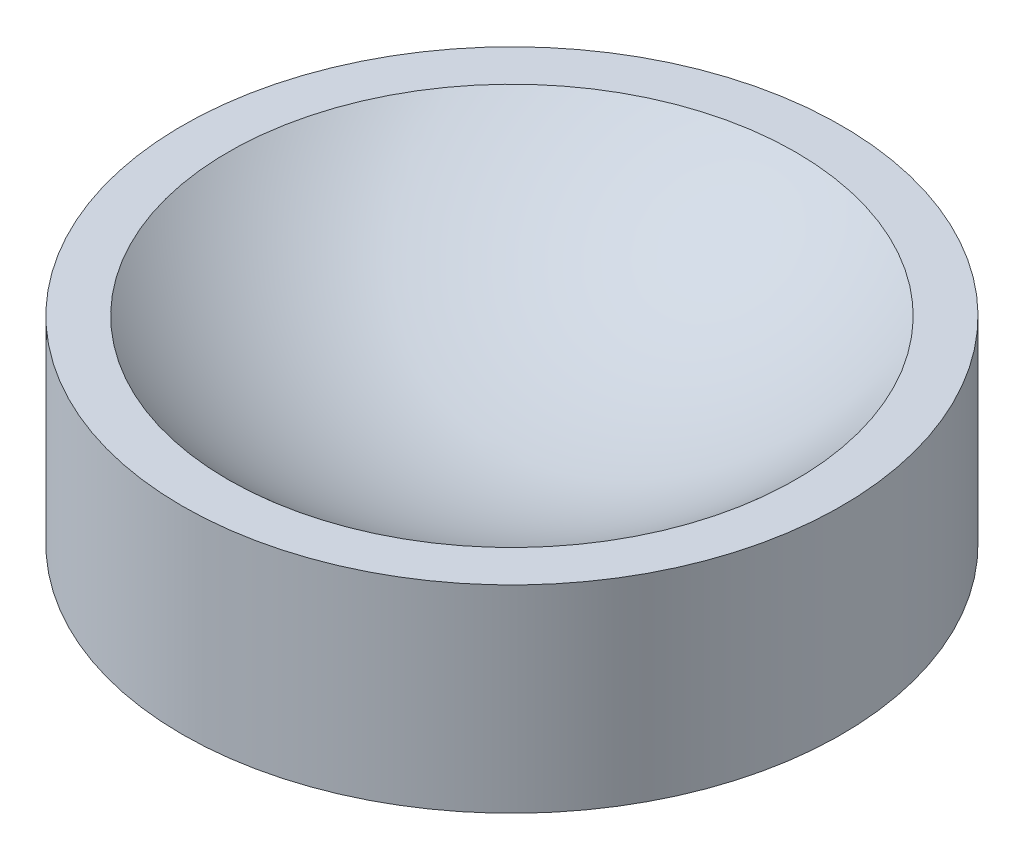
ISO-10303-21;
HEADER;
FILE_DESCRIPTION(('STEP AP214'),'2;1');
FILE_NAME('part.step','',(''),(''),'','','');
FILE_SCHEMA(('AUTOMOTIVE_DESIGN { 1 0 10303 214 1 1 1 1 }'));
ENDSEC;
DATA;
#1=APPLICATION_CONTEXT('core data for automotive mechanical design processes');
#2=APPLICATION_PROTOCOL_DEFINITION('international standard','automotive_design',2000,#1);
#3=PRODUCT_CONTEXT('',#1,'mechanical');
#4=PRODUCT('Part','Part','',(#3));
#5=PRODUCT_RELATED_PRODUCT_CATEGORY('part','',(#4));
#6=PRODUCT_DEFINITION_FORMATION('','',#4);
#7=PRODUCT_DEFINITION_CONTEXT('part definition',#1,'design');
#8=PRODUCT_DEFINITION('design','',#6,#7);
#9=PRODUCT_DEFINITION_SHAPE('','',#8);
#10=(LENGTH_UNIT() NAMED_UNIT(*) SI_UNIT(.MILLI.,.METRE.));
#11=(NAMED_UNIT(*) PLANE_ANGLE_UNIT() SI_UNIT($,.RADIAN.));
#12=(NAMED_UNIT(*) SI_UNIT($,.STERADIAN.) SOLID_ANGLE_UNIT());
#13=UNCERTAINTY_MEASURE_WITH_UNIT(LENGTH_MEASURE(1.E-05),#10,'distance_accuracy_value','');
#14=(GEOMETRIC_REPRESENTATION_CONTEXT(3) GLOBAL_UNCERTAINTY_ASSIGNED_CONTEXT((#13)) GLOBAL_UNIT_ASSIGNED_CONTEXT((#10,
#11,#12)) REPRESENTATION_CONTEXT('',''));
#15=CARTESIAN_POINT('',(0.,0.,0.));
#16=DIRECTION('',(0.,0.,1.));
#17=DIRECTION('',(1.,0.,0.));
#18=AXIS2_PLACEMENT_3D('',#15,#16,#17);
#19=CARTESIAN_POINT('',(0.,15.,0.));
#20=DIRECTION('',(0.,-1.,0.));
#21=DIRECTION('',(0.,0.,-1.));
#22=AXIS2_PLACEMENT_3D('',#19,#20,#21);
#23=CYLINDRICAL_SURFACE('',#22,25.);
#24=CARTESIAN_POINT('',(0.,15.,0.));
#25=DIRECTION('',(0.,1.,0.));
#26=DIRECTION('',(0.,0.,1.));
#27=AXIS2_PLACEMENT_3D('',#24,#25,#26);
#28=CIRCLE('',#27,25.);
#29=CARTESIAN_POINT('',(0.,15.,25.));
#30=VERTEX_POINT('',#29);
#31=EDGE_CURVE('E10',#30,#30,#28,.T.);
#32=ORIENTED_EDGE('',*,*,#31,.F.);
#33=EDGE_LOOP('',(#32));
#34=FACE_BOUND('',#33,.T.);
#35=CARTESIAN_POINT('',(0.,0.,0.));
#36=DIRECTION('',(0.,1.,0.));
#37=DIRECTION('',(0.,0.,1.));
#38=AXIS2_PLACEMENT_3D('',#35,#36,#37);
#39=CIRCLE('',#38,25.);
#40=CARTESIAN_POINT('',(0.,0.,25.));
#41=VERTEX_POINT('',#40);
#42=EDGE_CURVE('E51',#41,#41,#39,.T.);
#43=ORIENTED_EDGE('',*,*,#42,.T.);
#44=EDGE_LOOP('',(#43));
#45=FACE_BOUND('',#44,.T.);
#46=ADVANCED_FACE('F43',(#34,#45),#23,.T.);
#47=CARTESIAN_POINT('',(0.,15.,0.));
#48=DIRECTION('',(0.,1.,0.));
#49=DIRECTION('',(0.,0.,1.));
#50=AXIS2_PLACEMENT_3D('',#47,#48,#49);
#51=PLANE('',#50);
#52=CARTESIAN_POINT('',(0.,15.,0.));
#53=DIRECTION('',(0.,1.,0.));
#54=DIRECTION('',(0.,0.,1.));
#55=AXIS2_PLACEMENT_3D('',#52,#53,#54);
#56=CIRCLE('',#55,21.5232432500309);
#57=CARTESIAN_POINT('',(0.,15.,21.5232432500309));
#58=VERTEX_POINT('',#57);
#59=EDGE_CURVE('E46',#58,#58,#56,.F.);
#60=ORIENTED_EDGE('',*,*,#59,.T.);
#61=EDGE_LOOP('',(#60));
#62=FACE_BOUND('',#61,.T.);
#63=ORIENTED_EDGE('',*,*,#31,.T.);
#64=EDGE_LOOP('',(#63));
#65=FACE_BOUND('',#64,.T.);
#66=ADVANCED_FACE('F63',(#62,#65),#51,.T.);
#67=CARTESIAN_POINT('',(0.,0.,0.));
#68=DIRECTION('',(0.,1.,0.));
#69=DIRECTION('',(0.,0.,1.));
#70=AXIS2_PLACEMENT_3D('',#67,#68,#69);
#71=PLANE('',#70);
#72=ORIENTED_EDGE('',*,*,#42,.F.);
#73=EDGE_LOOP('',(#72));
#74=FACE_BOUND('',#73,.T.);
#75=ADVANCED_FACE('F67',(#74),#71,.F.);
#76=CARTESIAN_POINT('',(0.,38.,0.));
#77=DIRECTION('',(-1.,0.,0.));
#78=DIRECTION('',(0.,0.,-1.));
#79=AXIS2_PLACEMENT_3D('',#76,#77,#78);
#80=SPHERICAL_SURFACE('',#79,31.5);
#81=CARTESIAN_POINT('',(0.,38.,0.));
#82=DIRECTION('',(0.,1.,0.));
#83=DIRECTION('',(0.,0.,1.));
#84=AXIS2_PLACEMENT_3D('',#81,#82,#83);
#85=SPHERICAL_SURFACE('',#84,31.5);
#86=ORIENTED_EDGE('',*,*,#59,.F.);
#87=EDGE_LOOP('',(#86));
#88=FACE_BOUND('',#87,.T.);
#89=ADVANCED_FACE('F65',(#88),#85,.F.);
#90=CLOSED_SHELL('',(#46,#66,#75,#89));
#91=MANIFOLD_SOLID_BREP('B2',#90);
#92=ADVANCED_BREP_SHAPE_REPRESENTATION('',(#18,#91),#14);
#93=SHAPE_DEFINITION_REPRESENTATION(#9,#92);
ENDSEC;
END-ISO-10303-21;
